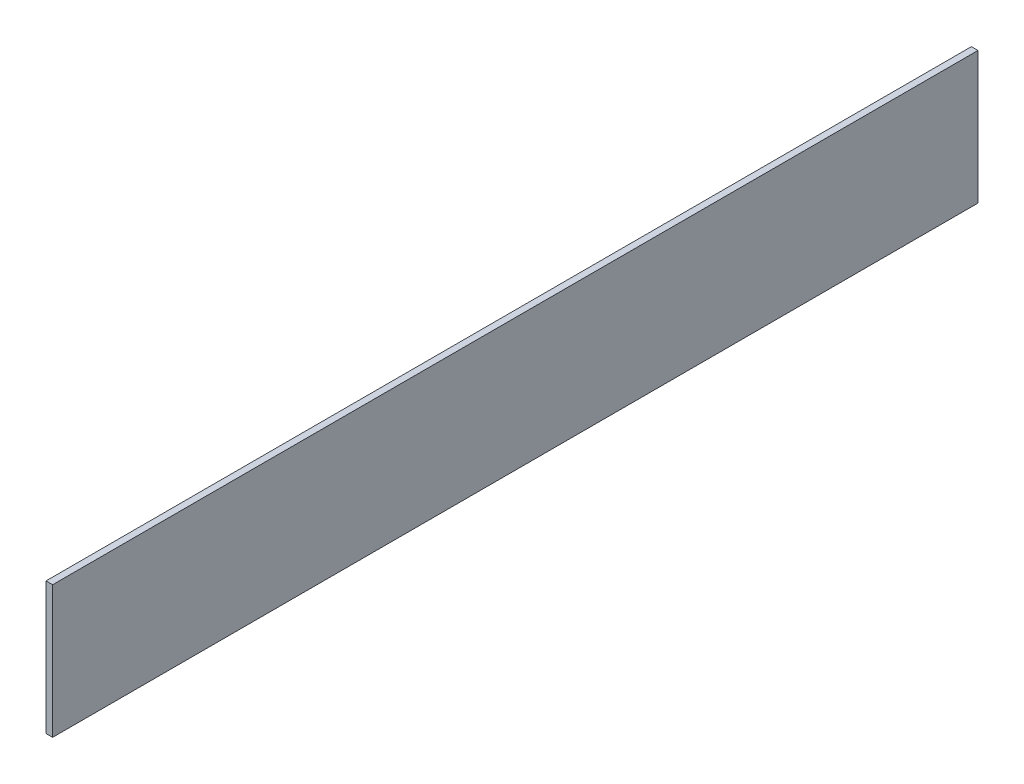
ISO-10303-21;
HEADER;
FILE_DESCRIPTION(('STEP AP214'),'2;1');
FILE_NAME('part.step','',(''),(''),'','','');
FILE_SCHEMA(('AUTOMOTIVE_DESIGN { 1 0 10303 214 1 1 1 1 }'));
ENDSEC;
DATA;
#1=APPLICATION_CONTEXT('core data for automotive mechanical design processes');
#2=APPLICATION_PROTOCOL_DEFINITION('international standard','automotive_design',2000,#1);
#3=PRODUCT_CONTEXT('',#1,'mechanical');
#4=PRODUCT('Part','Part','',(#3));
#5=PRODUCT_RELATED_PRODUCT_CATEGORY('part','',(#4));
#6=PRODUCT_DEFINITION_FORMATION('','',#4);
#7=PRODUCT_DEFINITION_CONTEXT('part definition',#1,'design');
#8=PRODUCT_DEFINITION('design','',#6,#7);
#9=PRODUCT_DEFINITION_SHAPE('','',#8);
#10=(LENGTH_UNIT() NAMED_UNIT(*) SI_UNIT(.MILLI.,.METRE.));
#11=(NAMED_UNIT(*) PLANE_ANGLE_UNIT() SI_UNIT($,.RADIAN.));
#12=(NAMED_UNIT(*) SI_UNIT($,.STERADIAN.) SOLID_ANGLE_UNIT());
#13=UNCERTAINTY_MEASURE_WITH_UNIT(LENGTH_MEASURE(1.E-05),#10,'distance_accuracy_value','');
#14=(GEOMETRIC_REPRESENTATION_CONTEXT(3) GLOBAL_UNCERTAINTY_ASSIGNED_CONTEXT((#13)) GLOBAL_UNIT_ASSIGNED_CONTEXT((#10,
#11,#12)) REPRESENTATION_CONTEXT('',''));
#15=CARTESIAN_POINT('',(0.,0.,0.));
#16=DIRECTION('',(0.,0.,1.));
#17=DIRECTION('',(1.,0.,0.));
#18=AXIS2_PLACEMENT_3D('',#15,#16,#17);
#19=CARTESIAN_POINT('',(349.,360.,-440.));
#20=DIRECTION('',(-1.,0.,0.));
#21=DIRECTION('',(0.,0.,1.));
#22=AXIS2_PLACEMENT_3D('',#19,#20,#21);
#23=PLANE('',#22);
#24=DIRECTION('',(0.,-1.,0.));
#25=VECTOR('',#24,1.);
#26=CARTESIAN_POINT('',(349.,360.,-160.));
#27=LINE('',#26,#25);
#28=CARTESIAN_POINT('',(349.,400.,-160.));
#29=VERTEX_POINT('',#28);
#30=CARTESIAN_POINT('',(349.,360.,-160.));
#31=VERTEX_POINT('',#30);
#32=EDGE_CURVE('E103',#29,#31,#27,.T.);
#33=ORIENTED_EDGE('',*,*,#32,.F.);
#34=DIRECTION('',(0.,0.,1.));
#35=VECTOR('',#34,1.);
#36=CARTESIAN_POINT('',(349.,400.,-440.));
#37=LINE('',#36,#35);
#38=CARTESIAN_POINT('',(349.,400.,-440.));
#39=VERTEX_POINT('',#38);
#40=EDGE_CURVE('E11',#39,#29,#37,.T.);
#41=ORIENTED_EDGE('',*,*,#40,.F.);
#42=DIRECTION('',(0.,-1.,0.));
#43=VECTOR('',#42,1.);
#44=CARTESIAN_POINT('',(349.,360.,-440.));
#45=LINE('',#44,#43);
#46=CARTESIAN_POINT('',(349.,360.,-440.));
#47=VERTEX_POINT('',#46);
#48=EDGE_CURVE('E97',#39,#47,#45,.T.);
#49=ORIENTED_EDGE('',*,*,#48,.T.);
#50=DIRECTION('',(0.,0.,1.));
#51=VECTOR('',#50,1.);
#52=CARTESIAN_POINT('',(349.,360.,-440.));
#53=LINE('',#52,#51);
#54=EDGE_CURVE('E42',#47,#31,#53,.T.);
#55=ORIENTED_EDGE('',*,*,#54,.T.);
#56=EDGE_LOOP('',(#33,#41,#49,#55));
#57=FACE_BOUND('',#56,.T.);
#58=ADVANCED_FACE('F39',(#57),#23,.T.);
#59=CARTESIAN_POINT('',(349.,400.,-440.));
#60=DIRECTION('',(0.,1.,0.));
#61=DIRECTION('',(0.,0.,1.));
#62=AXIS2_PLACEMENT_3D('',#59,#60,#61);
#63=PLANE('',#62);
#64=DIRECTION('',(-1.,0.,0.));
#65=VECTOR('',#64,1.);
#66=CARTESIAN_POINT('',(349.,400.,-160.));
#67=LINE('',#66,#65);
#68=CARTESIAN_POINT('',(351.,400.,-160.));
#69=VERTEX_POINT('',#68);
#70=EDGE_CURVE('E99',#69,#29,#67,.T.);
#71=ORIENTED_EDGE('',*,*,#70,.F.);
#72=DIRECTION('',(0.,0.,1.));
#73=VECTOR('',#72,1.);
#74=CARTESIAN_POINT('',(351.,400.,-440.));
#75=LINE('',#74,#73);
#76=CARTESIAN_POINT('',(351.,400.,-440.));
#77=VERTEX_POINT('',#76);
#78=EDGE_CURVE('E48',#77,#69,#75,.T.);
#79=ORIENTED_EDGE('',*,*,#78,.F.);
#80=DIRECTION('',(-1.,0.,0.));
#81=VECTOR('',#80,1.);
#82=CARTESIAN_POINT('',(349.,400.,-440.));
#83=LINE('',#82,#81);
#84=EDGE_CURVE('E94',#77,#39,#83,.T.);
#85=ORIENTED_EDGE('',*,*,#84,.T.);
#86=ORIENTED_EDGE('',*,*,#40,.T.);
#87=EDGE_LOOP('',(#71,#79,#85,#86));
#88=FACE_BOUND('',#87,.T.);
#89=ADVANCED_FACE('F113',(#88),#63,.T.);
#90=CARTESIAN_POINT('',(351.,360.,-440.));
#91=DIRECTION('',(1.,0.,0.));
#92=DIRECTION('',(0.,0.,-1.));
#93=AXIS2_PLACEMENT_3D('',#90,#91,#92);
#94=PLANE('',#93);
#95=DIRECTION('',(0.,1.,0.));
#96=VECTOR('',#95,1.);
#97=CARTESIAN_POINT('',(351.,360.,-160.));
#98=LINE('',#97,#96);
#99=CARTESIAN_POINT('',(351.,360.,-160.));
#100=VERTEX_POINT('',#99);
#101=EDGE_CURVE('E89',#100,#69,#98,.T.);
#102=ORIENTED_EDGE('',*,*,#101,.F.);
#103=DIRECTION('',(0.,0.,1.));
#104=VECTOR('',#103,1.);
#105=CARTESIAN_POINT('',(351.,360.,-440.));
#106=LINE('',#105,#104);
#107=CARTESIAN_POINT('',(351.,360.,-440.));
#108=VERTEX_POINT('',#107);
#109=EDGE_CURVE('E84',#108,#100,#106,.T.);
#110=ORIENTED_EDGE('',*,*,#109,.F.);
#111=DIRECTION('',(0.,1.,0.));
#112=VECTOR('',#111,1.);
#113=CARTESIAN_POINT('',(351.,360.,-440.));
#114=LINE('',#113,#112);
#115=EDGE_CURVE('E87',#108,#77,#114,.T.);
#116=ORIENTED_EDGE('',*,*,#115,.T.);
#117=ORIENTED_EDGE('',*,*,#78,.T.);
#118=EDGE_LOOP('',(#102,#110,#116,#117));
#119=FACE_BOUND('',#118,.T.);
#120=ADVANCED_FACE('F86',(#119),#94,.T.);
#121=CARTESIAN_POINT('',(349.,360.,-440.));
#122=DIRECTION('',(0.,-1.,0.));
#123=DIRECTION('',(0.,0.,-1.));
#124=AXIS2_PLACEMENT_3D('',#121,#122,#123);
#125=PLANE('',#124);
#126=DIRECTION('',(1.,0.,0.));
#127=VECTOR('',#126,1.);
#128=CARTESIAN_POINT('',(349.,360.,-160.));
#129=LINE('',#128,#127);
#130=EDGE_CURVE('E106',#31,#100,#129,.T.);
#131=ORIENTED_EDGE('',*,*,#130,.F.);
#132=ORIENTED_EDGE('',*,*,#54,.F.);
#133=DIRECTION('',(1.,0.,0.));
#134=VECTOR('',#133,1.);
#135=CARTESIAN_POINT('',(349.,360.,-440.));
#136=LINE('',#135,#134);
#137=EDGE_CURVE('E93',#47,#108,#136,.T.);
#138=ORIENTED_EDGE('',*,*,#137,.T.);
#139=ORIENTED_EDGE('',*,*,#109,.T.);
#140=EDGE_LOOP('',(#131,#132,#138,#139));
#141=FACE_BOUND('',#140,.T.);
#142=ADVANCED_FACE('F96',(#141),#125,.T.);
#143=CARTESIAN_POINT('',(0.,0.,-440.));
#144=DIRECTION('',(0.,0.,-1.));
#145=DIRECTION('',(-1.,0.,0.));
#146=AXIS2_PLACEMENT_3D('',#143,#144,#145);
#147=PLANE('',#146);
#148=ORIENTED_EDGE('',*,*,#48,.F.);
#149=ORIENTED_EDGE('',*,*,#84,.F.);
#150=ORIENTED_EDGE('',*,*,#115,.F.);
#151=ORIENTED_EDGE('',*,*,#137,.F.);
#152=EDGE_LOOP('',(#148,#149,#150,#151));
#153=FACE_BOUND('',#152,.T.);
#154=ADVANCED_FACE('F92',(#153),#147,.T.);
#155=CARTESIAN_POINT('',(0.,0.,-160.));
#156=DIRECTION('',(0.,0.,-1.));
#157=DIRECTION('',(-1.,0.,0.));
#158=AXIS2_PLACEMENT_3D('',#155,#156,#157);
#159=PLANE('',#158);
#160=ORIENTED_EDGE('',*,*,#32,.T.);
#161=ORIENTED_EDGE('',*,*,#130,.T.);
#162=ORIENTED_EDGE('',*,*,#101,.T.);
#163=ORIENTED_EDGE('',*,*,#70,.T.);
#164=EDGE_LOOP('',(#160,#161,#162,#163));
#165=FACE_BOUND('',#164,.T.);
#166=ADVANCED_FACE('F112',(#165),#159,.F.);
#167=CLOSED_SHELL('',(#58,#89,#120,#142,#154,#166));
#168=MANIFOLD_SOLID_BREP('B2',#167);
#169=ADVANCED_BREP_SHAPE_REPRESENTATION('',(#18,#168),#14);
#170=SHAPE_DEFINITION_REPRESENTATION(#9,#169);
ENDSEC;
END-ISO-10303-21;
